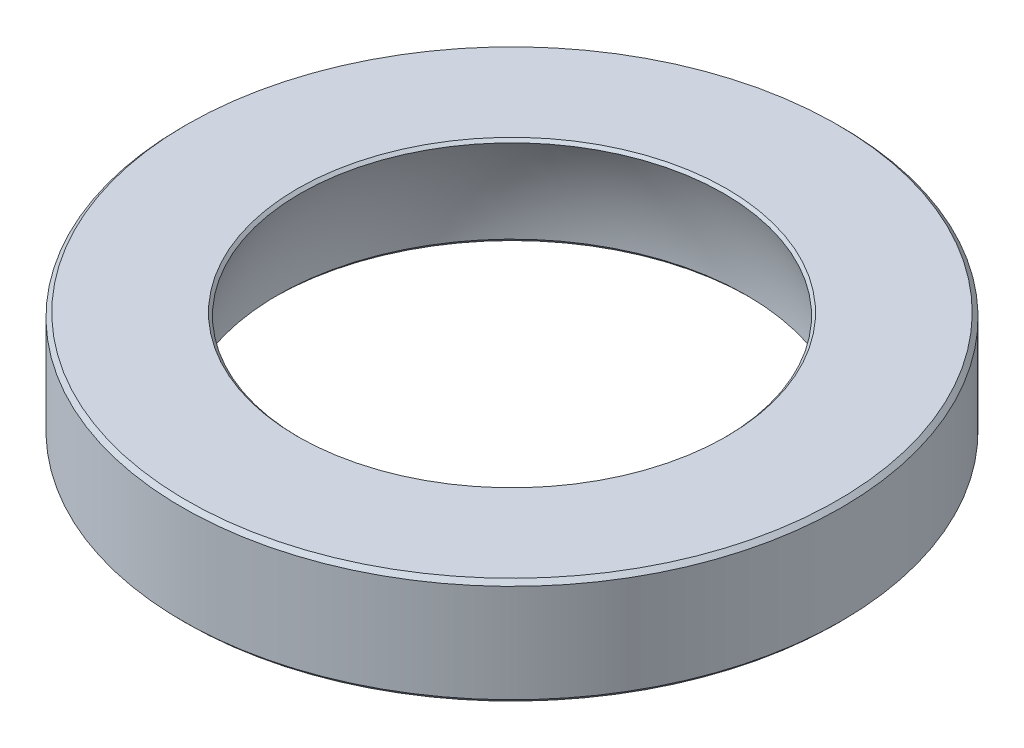
ISO-10303-21;
HEADER;
FILE_DESCRIPTION(('STEP AP214'),'2;1');
FILE_NAME('part.step','',(''),(''),'','','');
FILE_SCHEMA(('AUTOMOTIVE_DESIGN { 1 0 10303 214 1 1 1 1 }'));
ENDSEC;
DATA;
#1=APPLICATION_CONTEXT('core data for automotive mechanical design processes');
#2=APPLICATION_PROTOCOL_DEFINITION('international standard','automotive_design',2000,#1);
#3=PRODUCT_CONTEXT('',#1,'mechanical');
#4=PRODUCT('Part','Part','',(#3));
#5=PRODUCT_RELATED_PRODUCT_CATEGORY('part','',(#4));
#6=PRODUCT_DEFINITION_FORMATION('','',#4);
#7=PRODUCT_DEFINITION_CONTEXT('part definition',#1,'design');
#8=PRODUCT_DEFINITION('design','',#6,#7);
#9=PRODUCT_DEFINITION_SHAPE('','',#8);
#10=(LENGTH_UNIT() NAMED_UNIT(*) SI_UNIT(.MILLI.,.METRE.));
#11=(NAMED_UNIT(*) PLANE_ANGLE_UNIT() SI_UNIT($,.RADIAN.));
#12=(NAMED_UNIT(*) SI_UNIT($,.STERADIAN.) SOLID_ANGLE_UNIT());
#13=UNCERTAINTY_MEASURE_WITH_UNIT(LENGTH_MEASURE(1.E-05),#10,'distance_accuracy_value','');
#14=(GEOMETRIC_REPRESENTATION_CONTEXT(3) GLOBAL_UNCERTAINTY_ASSIGNED_CONTEXT((#13)) GLOBAL_UNIT_ASSIGNED_CONTEXT((#10,
#11,#12)) REPRESENTATION_CONTEXT('',''));
#15=CARTESIAN_POINT('',(0.,0.,0.));
#16=DIRECTION('',(0.,0.,1.));
#17=DIRECTION('',(1.,0.,0.));
#18=AXIS2_PLACEMENT_3D('',#15,#16,#17);
#19=CARTESIAN_POINT('',(0.,6.,0.));
#20=DIRECTION('',(0.,1.,0.));
#21=DIRECTION('',(-1.,0.,0.));
#22=AXIS2_PLACEMENT_3D('',#19,#20,#21);
#23=CYLINDRICAL_SURFACE('',#22,12.);
#24=CARTESIAN_POINT('',(0.,0.149999999999997,0.));
#25=DIRECTION('',(0.,1.,0.));
#26=DIRECTION('',(-1.,0.,0.));
#27=AXIS2_PLACEMENT_3D('',#24,#25,#26);
#28=CIRCLE('',#27,12.);
#29=CARTESIAN_POINT('',(-12.,0.149999999999994,0.));
#30=VERTEX_POINT('',#29);
#31=EDGE_CURVE('E45',#30,#30,#28,.T.);
#32=ORIENTED_EDGE('',*,*,#31,.T.);
#33=EDGE_LOOP('',(#32));
#34=FACE_BOUND('',#33,.T.);
#35=CARTESIAN_POINT('',(0.,3.72500000000001,0.));
#36=DIRECTION('',(0.,1.,0.));
#37=DIRECTION('',(-1.,0.,0.));
#38=AXIS2_PLACEMENT_3D('',#35,#36,#37);
#39=CIRCLE('',#38,12.);
#40=CARTESIAN_POINT('',(-12.,3.72500000000001,0.));
#41=VERTEX_POINT('',#40);
#42=EDGE_CURVE('E49',#41,#41,#39,.F.);
#43=ORIENTED_EDGE('',*,*,#42,.T.);
#44=EDGE_LOOP('',(#43));
#45=FACE_BOUND('',#44,.T.);
#46=ADVANCED_FACE('F33',(#34,#45),#23,.T.);
#47=CARTESIAN_POINT('',(0.,0.,0.));
#48=DIRECTION('',(0.,1.,0.));
#49=DIRECTION('',(-1.,0.,0.));
#50=AXIS2_PLACEMENT_3D('',#47,#48,#49);
#51=DEGENERATE_TOROIDAL_SURFACE('',#50,0.458203932499365,9.,.F.);
#52=CARTESIAN_POINT('',(0.,0.151271369082408,0.));
#53=DIRECTION('',(0.,-1.,0.));
#54=DIRECTION('',(0.,0.,-1.));
#55=AXIS2_PLACEMENT_3D('',#52,#53,#54);
#56=CIRCLE('',#55,8.54052469841822);
#57=CARTESIAN_POINT('',(0.,0.151271369082408,-8.54052469841822));
#58=VERTEX_POINT('',#57);
#59=EDGE_CURVE('E54',#58,#58,#56,.T.);
#60=ORIENTED_EDGE('',*,*,#59,.T.);
#61=EDGE_LOOP('',(#60));
#62=FACE_BOUND('',#61,.T.);
#63=CARTESIAN_POINT('',(0.,3.77291529788518,0.));
#64=DIRECTION('',(0.,-1.,0.));
#65=DIRECTION('',(1.,0.,0.));
#66=AXIS2_PLACEMENT_3D('',#63,#64,#65);
#67=CIRCLE('',#66,7.7127880608258);
#68=CARTESIAN_POINT('',(7.7127880608258,3.77291529788518,0.));
#69=VERTEX_POINT('',#68);
#70=EDGE_CURVE('E57',#69,#69,#67,.F.);
#71=ORIENTED_EDGE('',*,*,#70,.T.);
#72=EDGE_LOOP('',(#71));
#73=FACE_BOUND('',#72,.T.);
#74=ADVANCED_FACE('F85',(#62,#73),#51,.T.);
#75=CARTESIAN_POINT('',(-12.,3.875,0.));
#76=DIRECTION('',(0.,1.,0.));
#77=DIRECTION('',(-1.,0.,0.));
#78=AXIS2_PLACEMENT_3D('',#75,#76,#77);
#79=PLANE('',#78);
#80=CARTESIAN_POINT('',(0.,3.875,0.));
#81=DIRECTION('',(0.,1.,0.));
#82=DIRECTION('',(-1.,0.,0.));
#83=AXIS2_PLACEMENT_3D('',#80,#81,#82);
#84=CIRCLE('',#83,7.81487276294063);
#85=CARTESIAN_POINT('',(-7.81487276294063,3.875,0.));
#86=VERTEX_POINT('',#85);
#87=EDGE_CURVE('E10',#86,#86,#84,.F.);
#88=ORIENTED_EDGE('',*,*,#87,.T.);
#89=EDGE_LOOP('',(#88));
#90=FACE_BOUND('',#89,.T.);
#91=CARTESIAN_POINT('',(0.,3.875,0.));
#92=DIRECTION('',(0.,1.,0.));
#93=DIRECTION('',(-1.,0.,0.));
#94=AXIS2_PLACEMENT_3D('',#91,#92,#93);
#95=CIRCLE('',#94,11.85);
#96=CARTESIAN_POINT('',(-11.85,3.875,0.));
#97=VERTEX_POINT('',#96);
#98=EDGE_CURVE('E41',#97,#97,#95,.T.);
#99=ORIENTED_EDGE('',*,*,#98,.T.);
#100=EDGE_LOOP('',(#99));
#101=FACE_BOUND('',#100,.T.);
#102=ADVANCED_FACE('F91',(#90,#101),#79,.T.);
#103=CARTESIAN_POINT('',(-12.,0.,-12.));
#104=DIRECTION('',(0.,1.,0.));
#105=DIRECTION('',(0.,0.,1.));
#106=AXIS2_PLACEMENT_3D('',#103,#104,#105);
#107=PLANE('',#106);
#108=CARTESIAN_POINT('',(0.,0.,0.));
#109=DIRECTION('',(0.,1.,0.));
#110=DIRECTION('',(0.,0.,1.));
#111=AXIS2_PLACEMENT_3D('',#108,#109,#110);
#112=CIRCLE('',#111,8.69179606750063);
#113=CARTESIAN_POINT('',(0.,0.,8.69179606750063));
#114=VERTEX_POINT('',#113);
#115=EDGE_CURVE('E60',#114,#114,#112,.T.);
#116=ORIENTED_EDGE('',*,*,#115,.T.);
#117=EDGE_LOOP('',(#116));
#118=FACE_BOUND('',#117,.T.);
#119=CARTESIAN_POINT('',(0.,0.,0.));
#120=DIRECTION('',(0.,1.,0.));
#121=DIRECTION('',(0.,0.,1.));
#122=AXIS2_PLACEMENT_3D('',#119,#120,#121);
#123=CIRCLE('',#122,11.85);
#124=CARTESIAN_POINT('',(0.,0.,11.85));
#125=VERTEX_POINT('',#124);
#126=EDGE_CURVE('E63',#125,#125,#123,.F.);
#127=ORIENTED_EDGE('',*,*,#126,.T.);
#128=EDGE_LOOP('',(#127));
#129=FACE_BOUND('',#128,.T.);
#130=ADVANCED_FACE('F67',(#118,#129),#107,.F.);
#131=CARTESIAN_POINT('',(0.,0.,0.));
#132=DIRECTION('',(0.,-1.,0.));
#133=DIRECTION('',(0.,0.,-1.));
#134=AXIS2_PLACEMENT_3D('',#131,#132,#133);
#135=CONICAL_SURFACE('',#134,8.69179606750063,0.785398163397437);
#136=ORIENTED_EDGE('',*,*,#59,.F.);
#137=EDGE_LOOP('',(#136));
#138=FACE_BOUND('',#137,.T.);
#139=ORIENTED_EDGE('',*,*,#115,.F.);
#140=EDGE_LOOP('',(#139));
#141=FACE_BOUND('',#140,.T.);
#142=ADVANCED_FACE('F72',(#138,#141),#135,.F.);
#143=CARTESIAN_POINT('',(0.,0.,0.));
#144=DIRECTION('',(0.,1.,0.));
#145=DIRECTION('',(-1.,0.,0.));
#146=AXIS2_PLACEMENT_3D('',#143,#144,#145);
#147=CONICAL_SURFACE('',#146,11.85,0.785398163397448);
#148=ORIENTED_EDGE('',*,*,#31,.F.);
#149=EDGE_LOOP('',(#148));
#150=FACE_BOUND('',#149,.T.);
#151=ORIENTED_EDGE('',*,*,#126,.F.);
#152=EDGE_LOOP('',(#151));
#153=FACE_BOUND('',#152,.T.);
#154=ADVANCED_FACE('F69',(#150,#153),#147,.T.);
#155=CARTESIAN_POINT('',(0.,3.77291529788518,0.));
#156=DIRECTION('',(0.,1.,0.));
#157=DIRECTION('',(-1.,0.,0.));
#158=AXIS2_PLACEMENT_3D('',#155,#156,#157);
#159=CONICAL_SURFACE('',#158,7.7127880608258,0.785398163397448);
#160=ORIENTED_EDGE('',*,*,#87,.F.);
#161=EDGE_LOOP('',(#160));
#162=FACE_BOUND('',#161,.T.);
#163=ORIENTED_EDGE('',*,*,#70,.F.);
#164=EDGE_LOOP('',(#163));
#165=FACE_BOUND('',#164,.T.);
#166=ADVANCED_FACE('F71',(#162,#165),#159,.F.);
#167=CARTESIAN_POINT('',(0.,3.875,0.));
#168=DIRECTION('',(0.,-1.,0.));
#169=DIRECTION('',(1.,0.,0.));
#170=AXIS2_PLACEMENT_3D('',#167,#168,#169);
#171=CONICAL_SURFACE('',#170,11.85,0.785398163397448);
#172=ORIENTED_EDGE('',*,*,#42,.F.);
#173=EDGE_LOOP('',(#172));
#174=FACE_BOUND('',#173,.T.);
#175=ORIENTED_EDGE('',*,*,#98,.F.);
#176=EDGE_LOOP('',(#175));
#177=FACE_BOUND('',#176,.T.);
#178=ADVANCED_FACE('F36',(#174,#177),#171,.T.);
#179=CLOSED_SHELL('',(#46,#74,#102,#130,#142,#154,#166,#178));
#180=MANIFOLD_SOLID_BREP('B2',#179);
#181=ADVANCED_BREP_SHAPE_REPRESENTATION('',(#18,#180),#14);
#182=SHAPE_DEFINITION_REPRESENTATION(#9,#181);
ENDSEC;
END-ISO-10303-21;
